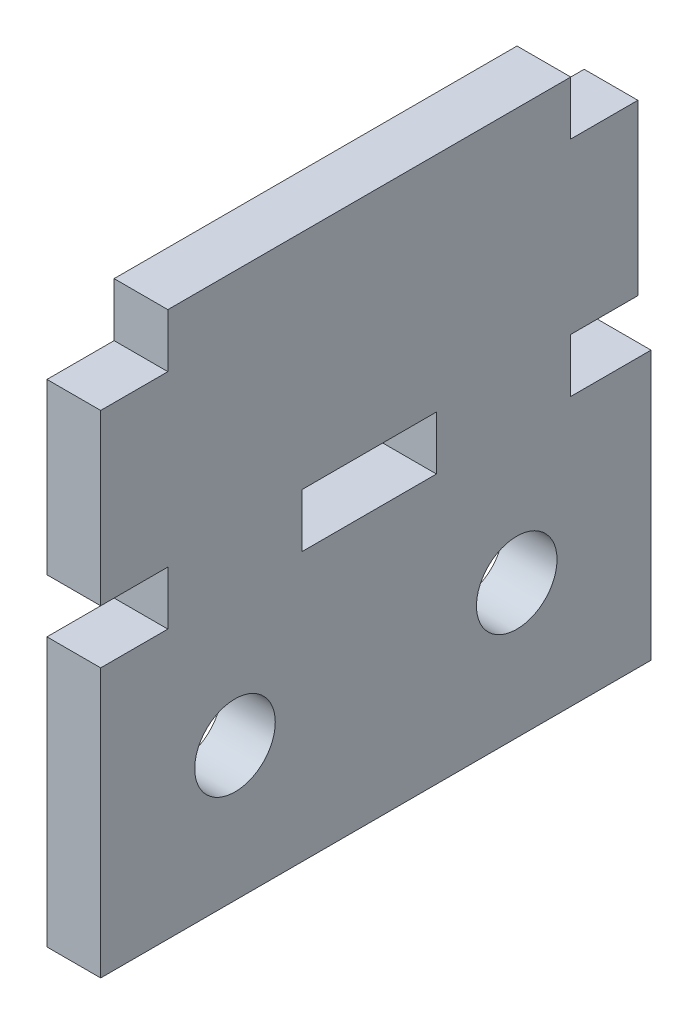
ISO-10303-21;
HEADER;
FILE_DESCRIPTION(('STEP AP214'),'2;1');
FILE_NAME('part.step','',(''),(''),'','','');
FILE_SCHEMA(('AUTOMOTIVE_DESIGN { 1 0 10303 214 1 1 1 1 }'));
ENDSEC;
DATA;
#1=APPLICATION_CONTEXT('core data for automotive mechanical design processes');
#2=APPLICATION_PROTOCOL_DEFINITION('international standard','automotive_design',2000,#1);
#3=PRODUCT_CONTEXT('',#1,'mechanical');
#4=PRODUCT('Part','Part','',(#3));
#5=PRODUCT_RELATED_PRODUCT_CATEGORY('part','',(#4));
#6=PRODUCT_DEFINITION_FORMATION('','',#4);
#7=PRODUCT_DEFINITION_CONTEXT('part definition',#1,'design');
#8=PRODUCT_DEFINITION('design','',#6,#7);
#9=PRODUCT_DEFINITION_SHAPE('','',#8);
#10=(LENGTH_UNIT() NAMED_UNIT(*) SI_UNIT(.MILLI.,.METRE.));
#11=(NAMED_UNIT(*) PLANE_ANGLE_UNIT() SI_UNIT($,.RADIAN.));
#12=(NAMED_UNIT(*) SI_UNIT($,.STERADIAN.) SOLID_ANGLE_UNIT());
#13=UNCERTAINTY_MEASURE_WITH_UNIT(LENGTH_MEASURE(1.E-05),#10,'distance_accuracy_value','');
#14=(GEOMETRIC_REPRESENTATION_CONTEXT(3) GLOBAL_UNCERTAINTY_ASSIGNED_CONTEXT((#13)) GLOBAL_UNIT_ASSIGNED_CONTEXT((#10,
#11,#12)) REPRESENTATION_CONTEXT('',''));
#15=CARTESIAN_POINT('',(0.,0.,0.));
#16=DIRECTION('',(0.,0.,1.));
#17=DIRECTION('',(1.,0.,0.));
#18=AXIS2_PLACEMENT_3D('',#15,#16,#17);
#19=CARTESIAN_POINT('',(2.,-3.15,-7.5));
#20=DIRECTION('',(0.,1.,0.));
#21=DIRECTION('',(0.,0.,1.));
#22=AXIS2_PLACEMENT_3D('',#19,#20,#21);
#23=PLANE('',#22);
#24=DIRECTION('',(0.,0.,-1.));
#25=VECTOR('',#24,1.);
#26=CARTESIAN_POINT('',(0.,-3.15,-7.5));
#27=LINE('',#26,#25);
#28=CARTESIAN_POINT('',(0.,-3.15,-7.5));
#29=VERTEX_POINT('',#28);
#30=CARTESIAN_POINT('',(0.,-3.15,-10.));
#31=VERTEX_POINT('',#30);
#32=EDGE_CURVE('E184',#29,#31,#27,.T.);
#33=ORIENTED_EDGE('',*,*,#32,.T.);
#34=DIRECTION('',(-1.,0.,0.));
#35=VECTOR('',#34,1.);
#36=CARTESIAN_POINT('',(2.,-3.15,-10.));
#37=LINE('',#36,#35);
#38=CARTESIAN_POINT('',(2.,-3.15,-10.));
#39=VERTEX_POINT('',#38);
#40=EDGE_CURVE('E11',#39,#31,#37,.T.);
#41=ORIENTED_EDGE('',*,*,#40,.F.);
#42=DIRECTION('',(0.,0.,-1.));
#43=VECTOR('',#42,1.);
#44=CARTESIAN_POINT('',(2.,-3.15,-7.5));
#45=LINE('',#44,#43);
#46=CARTESIAN_POINT('',(2.,-3.15,-7.5));
#47=VERTEX_POINT('',#46);
#48=EDGE_CURVE('E195',#47,#39,#45,.T.);
#49=ORIENTED_EDGE('',*,*,#48,.F.);
#50=DIRECTION('',(-1.,0.,0.));
#51=VECTOR('',#50,1.);
#52=CARTESIAN_POINT('',(2.,-3.15,-7.5));
#53=LINE('',#52,#51);
#54=EDGE_CURVE('E218',#47,#29,#53,.T.);
#55=ORIENTED_EDGE('',*,*,#54,.T.);
#56=EDGE_LOOP('',(#33,#41,#49,#55));
#57=FACE_BOUND('',#56,.T.);
#58=ADVANCED_FACE('F32',(#57),#23,.F.);
#59=CARTESIAN_POINT('',(2.,3.15,-10.));
#60=DIRECTION('',(0.,0.,1.));
#61=DIRECTION('',(1.,0.,0.));
#62=AXIS2_PLACEMENT_3D('',#59,#60,#61);
#63=PLANE('',#62);
#64=DIRECTION('',(0.,1.,0.));
#65=VECTOR('',#64,1.);
#66=CARTESIAN_POINT('',(0.,3.15,-10.));
#67=LINE('',#66,#65);
#68=CARTESIAN_POINT('',(0.,3.15,-10.));
#69=VERTEX_POINT('',#68);
#70=EDGE_CURVE('E221',#31,#69,#67,.T.);
#71=ORIENTED_EDGE('',*,*,#70,.T.);
#72=DIRECTION('',(-1.,0.,0.));
#73=VECTOR('',#72,1.);
#74=CARTESIAN_POINT('',(2.,3.15,-10.));
#75=LINE('',#74,#73);
#76=CARTESIAN_POINT('',(2.,3.15,-10.));
#77=VERTEX_POINT('',#76);
#78=EDGE_CURVE('E40',#77,#69,#75,.T.);
#79=ORIENTED_EDGE('',*,*,#78,.F.);
#80=DIRECTION('',(0.,1.,0.));
#81=VECTOR('',#80,1.);
#82=CARTESIAN_POINT('',(2.,3.15,-10.));
#83=LINE('',#82,#81);
#84=EDGE_CURVE('E111',#39,#77,#83,.T.);
#85=ORIENTED_EDGE('',*,*,#84,.F.);
#86=ORIENTED_EDGE('',*,*,#40,.T.);
#87=EDGE_LOOP('',(#71,#79,#85,#86));
#88=FACE_BOUND('',#87,.T.);
#89=ADVANCED_FACE('F302',(#88),#63,.F.);
#90=CARTESIAN_POINT('',(2.,3.15,-7.5));
#91=DIRECTION('',(0.,-1.,0.));
#92=DIRECTION('',(0.,0.,-1.));
#93=AXIS2_PLACEMENT_3D('',#90,#91,#92);
#94=PLANE('',#93);
#95=DIRECTION('',(0.,0.,1.));
#96=VECTOR('',#95,1.);
#97=CARTESIAN_POINT('',(0.,3.15,-7.5));
#98=LINE('',#97,#96);
#99=CARTESIAN_POINT('',(0.,3.15,-7.5));
#100=VERTEX_POINT('',#99);
#101=EDGE_CURVE('E223',#69,#100,#98,.T.);
#102=ORIENTED_EDGE('',*,*,#101,.T.);
#103=DIRECTION('',(-1.,0.,0.));
#104=VECTOR('',#103,1.);
#105=CARTESIAN_POINT('',(2.,3.15,-7.5));
#106=LINE('',#105,#104);
#107=CARTESIAN_POINT('',(2.,3.15,-7.5));
#108=VERTEX_POINT('',#107);
#109=EDGE_CURVE('E274',#108,#100,#106,.T.);
#110=ORIENTED_EDGE('',*,*,#109,.F.);
#111=DIRECTION('',(0.,0.,1.));
#112=VECTOR('',#111,1.);
#113=CARTESIAN_POINT('',(2.,3.15,-7.5));
#114=LINE('',#113,#112);
#115=EDGE_CURVE('E198',#77,#108,#114,.T.);
#116=ORIENTED_EDGE('',*,*,#115,.F.);
#117=ORIENTED_EDGE('',*,*,#78,.T.);
#118=EDGE_LOOP('',(#102,#110,#116,#117));
#119=FACE_BOUND('',#118,.T.);
#120=ADVANCED_FACE('F280',(#119),#94,.F.);
#121=CARTESIAN_POINT('',(2.,5.15,-7.5));
#122=DIRECTION('',(0.,0.,1.));
#123=DIRECTION('',(0.,-1.,0.));
#124=AXIS2_PLACEMENT_3D('',#121,#122,#123);
#125=PLANE('',#124);
#126=DIRECTION('',(0.,1.,0.));
#127=VECTOR('',#126,1.);
#128=CARTESIAN_POINT('',(0.,5.15,-7.5));
#129=LINE('',#128,#127);
#130=CARTESIAN_POINT('',(0.,5.15,-7.5));
#131=VERTEX_POINT('',#130);
#132=EDGE_CURVE('E225',#100,#131,#129,.T.);
#133=ORIENTED_EDGE('',*,*,#132,.T.);
#134=DIRECTION('',(-1.,0.,0.));
#135=VECTOR('',#134,1.);
#136=CARTESIAN_POINT('',(2.,5.15,-7.5));
#137=LINE('',#136,#135);
#138=CARTESIAN_POINT('',(2.,5.15,-7.5));
#139=VERTEX_POINT('',#138);
#140=EDGE_CURVE('E271',#139,#131,#137,.T.);
#141=ORIENTED_EDGE('',*,*,#140,.F.);
#142=DIRECTION('',(0.,1.,0.));
#143=VECTOR('',#142,1.);
#144=CARTESIAN_POINT('',(2.,5.15,-7.5));
#145=LINE('',#144,#143);
#146=EDGE_CURVE('E200',#108,#139,#145,.T.);
#147=ORIENTED_EDGE('',*,*,#146,.F.);
#148=ORIENTED_EDGE('',*,*,#109,.T.);
#149=EDGE_LOOP('',(#133,#141,#147,#148));
#150=FACE_BOUND('',#149,.T.);
#151=ADVANCED_FACE('F290',(#150),#125,.F.);
#152=CARTESIAN_POINT('',(2.,5.15,7.5));
#153=DIRECTION('',(0.,-1.,0.));
#154=DIRECTION('',(0.,0.,-1.));
#155=AXIS2_PLACEMENT_3D('',#152,#153,#154);
#156=PLANE('',#155);
#157=DIRECTION('',(0.,0.,1.));
#158=VECTOR('',#157,1.);
#159=CARTESIAN_POINT('',(0.,5.15,7.5));
#160=LINE('',#159,#158);
#161=CARTESIAN_POINT('',(0.,5.15,7.5));
#162=VERTEX_POINT('',#161);
#163=EDGE_CURVE('E228',#131,#162,#160,.T.);
#164=ORIENTED_EDGE('',*,*,#163,.T.);
#165=DIRECTION('',(-1.,0.,0.));
#166=VECTOR('',#165,1.);
#167=CARTESIAN_POINT('',(2.,5.15,7.5));
#168=LINE('',#167,#166);
#169=CARTESIAN_POINT('',(2.,5.15,7.5));
#170=VERTEX_POINT('',#169);
#171=EDGE_CURVE('E268',#170,#162,#168,.T.);
#172=ORIENTED_EDGE('',*,*,#171,.F.);
#173=DIRECTION('',(0.,0.,1.));
#174=VECTOR('',#173,1.);
#175=CARTESIAN_POINT('',(2.,5.15,-2.5));
#176=LINE('',#175,#174);
#177=EDGE_CURVE('E202',#139,#170,#176,.T.);
#178=ORIENTED_EDGE('',*,*,#177,.F.);
#179=ORIENTED_EDGE('',*,*,#140,.T.);
#180=EDGE_LOOP('',(#164,#172,#178,#179));
#181=FACE_BOUND('',#180,.T.);
#182=ADVANCED_FACE('F294',(#181),#156,.F.);
#183=CARTESIAN_POINT('',(2.,3.15,7.5));
#184=DIRECTION('',(0.,0.,-1.));
#185=DIRECTION('',(-1.,0.,0.));
#186=AXIS2_PLACEMENT_3D('',#183,#184,#185);
#187=PLANE('',#186);
#188=DIRECTION('',(0.,-1.,0.));
#189=VECTOR('',#188,1.);
#190=CARTESIAN_POINT('',(0.,3.15,7.5));
#191=LINE('',#190,#189);
#192=CARTESIAN_POINT('',(0.,3.15,7.5));
#193=VERTEX_POINT('',#192);
#194=EDGE_CURVE('E230',#162,#193,#191,.T.);
#195=ORIENTED_EDGE('',*,*,#194,.T.);
#196=DIRECTION('',(-1.,0.,0.));
#197=VECTOR('',#196,1.);
#198=CARTESIAN_POINT('',(2.,3.15,7.5));
#199=LINE('',#198,#197);
#200=CARTESIAN_POINT('',(2.,3.15,7.5));
#201=VERTEX_POINT('',#200);
#202=EDGE_CURVE('E265',#201,#193,#199,.T.);
#203=ORIENTED_EDGE('',*,*,#202,.F.);
#204=DIRECTION('',(0.,-1.,0.));
#205=VECTOR('',#204,1.);
#206=CARTESIAN_POINT('',(2.,3.15,7.5));
#207=LINE('',#206,#205);
#208=EDGE_CURVE('E204',#170,#201,#207,.T.);
#209=ORIENTED_EDGE('',*,*,#208,.F.);
#210=ORIENTED_EDGE('',*,*,#171,.T.);
#211=EDGE_LOOP('',(#195,#203,#209,#210));
#212=FACE_BOUND('',#211,.T.);
#213=ADVANCED_FACE('F314',(#212),#187,.F.);
#214=CARTESIAN_POINT('',(2.,3.15,10.));
#215=DIRECTION('',(0.,-1.,0.));
#216=DIRECTION('',(0.,0.,-1.));
#217=AXIS2_PLACEMENT_3D('',#214,#215,#216);
#218=PLANE('',#217);
#219=DIRECTION('',(0.,0.,1.));
#220=VECTOR('',#219,1.);
#221=CARTESIAN_POINT('',(0.,3.15,10.));
#222=LINE('',#221,#220);
#223=CARTESIAN_POINT('',(0.,3.15,10.));
#224=VERTEX_POINT('',#223);
#225=EDGE_CURVE('E232',#193,#224,#222,.T.);
#226=ORIENTED_EDGE('',*,*,#225,.T.);
#227=DIRECTION('',(-1.,0.,0.));
#228=VECTOR('',#227,1.);
#229=CARTESIAN_POINT('',(2.,3.15,10.));
#230=LINE('',#229,#228);
#231=CARTESIAN_POINT('',(2.,3.15,10.));
#232=VERTEX_POINT('',#231);
#233=EDGE_CURVE('E262',#232,#224,#230,.T.);
#234=ORIENTED_EDGE('',*,*,#233,.F.);
#235=DIRECTION('',(0.,0.,1.));
#236=VECTOR('',#235,1.);
#237=CARTESIAN_POINT('',(2.,3.15,10.));
#238=LINE('',#237,#236);
#239=EDGE_CURVE('E206',#201,#232,#238,.T.);
#240=ORIENTED_EDGE('',*,*,#239,.F.);
#241=ORIENTED_EDGE('',*,*,#202,.T.);
#242=EDGE_LOOP('',(#226,#234,#240,#241));
#243=FACE_BOUND('',#242,.T.);
#244=ADVANCED_FACE('F317',(#243),#218,.F.);
#245=CARTESIAN_POINT('',(2.,3.15,10.));
#246=DIRECTION('',(0.,0.,-1.));
#247=DIRECTION('',(-1.,0.,0.));
#248=AXIS2_PLACEMENT_3D('',#245,#246,#247);
#249=PLANE('',#248);
#250=DIRECTION('',(0.,-1.,0.));
#251=VECTOR('',#250,1.);
#252=CARTESIAN_POINT('',(0.,3.15,10.));
#253=LINE('',#252,#251);
#254=CARTESIAN_POINT('',(0.,-3.15,10.));
#255=VERTEX_POINT('',#254);
#256=EDGE_CURVE('E234',#224,#255,#253,.T.);
#257=ORIENTED_EDGE('',*,*,#256,.T.);
#258=DIRECTION('',(-1.,0.,0.));
#259=VECTOR('',#258,1.);
#260=CARTESIAN_POINT('',(2.,-3.15,10.));
#261=LINE('',#260,#259);
#262=CARTESIAN_POINT('',(2.,-3.15,10.));
#263=VERTEX_POINT('',#262);
#264=EDGE_CURVE('E259',#263,#255,#261,.T.);
#265=ORIENTED_EDGE('',*,*,#264,.F.);
#266=DIRECTION('',(0.,-1.,0.));
#267=VECTOR('',#266,1.);
#268=CARTESIAN_POINT('',(2.,3.15,10.));
#269=LINE('',#268,#267);
#270=EDGE_CURVE('E208',#232,#263,#269,.T.);
#271=ORIENTED_EDGE('',*,*,#270,.F.);
#272=ORIENTED_EDGE('',*,*,#233,.T.);
#273=EDGE_LOOP('',(#257,#265,#271,#272));
#274=FACE_BOUND('',#273,.T.);
#275=ADVANCED_FACE('F321',(#274),#249,.F.);
#276=CARTESIAN_POINT('',(2.,-3.15,10.));
#277=DIRECTION('',(0.,1.,0.));
#278=DIRECTION('',(0.,0.,1.));
#279=AXIS2_PLACEMENT_3D('',#276,#277,#278);
#280=PLANE('',#279);
#281=DIRECTION('',(0.,0.,-1.));
#282=VECTOR('',#281,1.);
#283=CARTESIAN_POINT('',(0.,-3.15,10.));
#284=LINE('',#283,#282);
#285=CARTESIAN_POINT('',(0.,-3.15,7.5));
#286=VERTEX_POINT('',#285);
#287=EDGE_CURVE('E236',#255,#286,#284,.T.);
#288=ORIENTED_EDGE('',*,*,#287,.T.);
#289=DIRECTION('',(-1.,0.,0.));
#290=VECTOR('',#289,1.);
#291=CARTESIAN_POINT('',(2.,-3.15,7.5));
#292=LINE('',#291,#290);
#293=CARTESIAN_POINT('',(2.,-3.15,7.5));
#294=VERTEX_POINT('',#293);
#295=EDGE_CURVE('E256',#294,#286,#292,.T.);
#296=ORIENTED_EDGE('',*,*,#295,.F.);
#297=DIRECTION('',(0.,0.,-1.));
#298=VECTOR('',#297,1.);
#299=CARTESIAN_POINT('',(2.,-3.15,10.));
#300=LINE('',#299,#298);
#301=EDGE_CURVE('E210',#263,#294,#300,.T.);
#302=ORIENTED_EDGE('',*,*,#301,.F.);
#303=ORIENTED_EDGE('',*,*,#264,.T.);
#304=EDGE_LOOP('',(#288,#296,#302,#303));
#305=FACE_BOUND('',#304,.T.);
#306=ADVANCED_FACE('F325',(#305),#280,.F.);
#307=CARTESIAN_POINT('',(2.,-3.15,7.5));
#308=DIRECTION('',(0.,0.,-1.));
#309=DIRECTION('',(-1.,0.,0.));
#310=AXIS2_PLACEMENT_3D('',#307,#308,#309);
#311=PLANE('',#310);
#312=DIRECTION('',(0.,-1.,0.));
#313=VECTOR('',#312,1.);
#314=CARTESIAN_POINT('',(0.,-3.15,7.5));
#315=LINE('',#314,#313);
#316=CARTESIAN_POINT('',(0.,-5.15,7.5));
#317=VERTEX_POINT('',#316);
#318=EDGE_CURVE('E238',#286,#317,#315,.T.);
#319=ORIENTED_EDGE('',*,*,#318,.T.);
#320=DIRECTION('',(-1.,0.,0.));
#321=VECTOR('',#320,1.);
#322=CARTESIAN_POINT('',(2.,-5.15,7.5));
#323=LINE('',#322,#321);
#324=CARTESIAN_POINT('',(2.,-5.15,7.5));
#325=VERTEX_POINT('',#324);
#326=EDGE_CURVE('E253',#325,#317,#323,.T.);
#327=ORIENTED_EDGE('',*,*,#326,.F.);
#328=DIRECTION('',(0.,-1.,0.));
#329=VECTOR('',#328,1.);
#330=CARTESIAN_POINT('',(2.,-3.15,7.5));
#331=LINE('',#330,#329);
#332=EDGE_CURVE('E212',#294,#325,#331,.T.);
#333=ORIENTED_EDGE('',*,*,#332,.F.);
#334=ORIENTED_EDGE('',*,*,#295,.T.);
#335=EDGE_LOOP('',(#319,#327,#333,#334));
#336=FACE_BOUND('',#335,.T.);
#337=ADVANCED_FACE('F329',(#336),#311,.F.);
#338=CARTESIAN_POINT('',(2.,-5.15,2.5));
#339=DIRECTION('',(0.,0.,1.));
#340=DIRECTION('',(1.,0.,0.));
#341=AXIS2_PLACEMENT_3D('',#338,#339,#340);
#342=PLANE('',#341);
#343=DIRECTION('',(0.,1.,0.));
#344=VECTOR('',#343,1.);
#345=CARTESIAN_POINT('',(0.,-5.15,2.5));
#346=LINE('',#345,#344);
#347=CARTESIAN_POINT('',(0.,-5.15,2.5));
#348=VERTEX_POINT('',#347);
#349=CARTESIAN_POINT('',(0.,-3.15,2.5));
#350=VERTEX_POINT('',#349);
#351=EDGE_CURVE('E240',#348,#350,#346,.T.);
#352=ORIENTED_EDGE('',*,*,#351,.T.);
#353=DIRECTION('',(-1.,0.,0.));
#354=VECTOR('',#353,1.);
#355=CARTESIAN_POINT('',(2.,-3.15,2.5));
#356=LINE('',#355,#354);
#357=CARTESIAN_POINT('',(2.,-3.15,2.5));
#358=VERTEX_POINT('',#357);
#359=EDGE_CURVE('E249',#358,#350,#356,.T.);
#360=ORIENTED_EDGE('',*,*,#359,.F.);
#361=DIRECTION('',(0.,1.,0.));
#362=VECTOR('',#361,1.);
#363=CARTESIAN_POINT('',(2.,-5.15,2.5));
#364=LINE('',#363,#362);
#365=CARTESIAN_POINT('',(2.,-5.15,2.5));
#366=VERTEX_POINT('',#365);
#367=EDGE_CURVE('E214',#366,#358,#364,.T.);
#368=ORIENTED_EDGE('',*,*,#367,.F.);
#369=DIRECTION('',(-1.,0.,0.));
#370=VECTOR('',#369,1.);
#371=CARTESIAN_POINT('',(2.,-5.15,2.5));
#372=LINE('',#371,#370);
#373=EDGE_CURVE('E171',#366,#348,#372,.T.);
#374=ORIENTED_EDGE('',*,*,#373,.T.);
#375=EDGE_LOOP('',(#352,#360,#368,#374));
#376=FACE_BOUND('',#375,.T.);
#377=ADVANCED_FACE('F333',(#376),#342,.F.);
#378=CARTESIAN_POINT('',(2.,-3.15,2.5));
#379=DIRECTION('',(0.,1.,0.));
#380=DIRECTION('',(0.,0.,1.));
#381=AXIS2_PLACEMENT_3D('',#378,#379,#380);
#382=PLANE('',#381);
#383=DIRECTION('',(0.,0.,-1.));
#384=VECTOR('',#383,1.);
#385=CARTESIAN_POINT('',(0.,-3.15,2.5));
#386=LINE('',#385,#384);
#387=CARTESIAN_POINT('',(0.,-3.15,-2.5));
#388=VERTEX_POINT('',#387);
#389=EDGE_CURVE('E242',#350,#388,#386,.T.);
#390=ORIENTED_EDGE('',*,*,#389,.T.);
#391=DIRECTION('',(-1.,0.,0.));
#392=VECTOR('',#391,1.);
#393=CARTESIAN_POINT('',(2.,-3.15,-2.5));
#394=LINE('',#393,#392);
#395=CARTESIAN_POINT('',(2.,-3.15,-2.5));
#396=VERTEX_POINT('',#395);
#397=EDGE_CURVE('E165',#396,#388,#394,.T.);
#398=ORIENTED_EDGE('',*,*,#397,.F.);
#399=DIRECTION('',(0.,0.,-1.));
#400=VECTOR('',#399,1.);
#401=CARTESIAN_POINT('',(2.,-3.15,2.5));
#402=LINE('',#401,#400);
#403=EDGE_CURVE('E157',#358,#396,#402,.T.);
#404=ORIENTED_EDGE('',*,*,#403,.F.);
#405=ORIENTED_EDGE('',*,*,#359,.T.);
#406=EDGE_LOOP('',(#390,#398,#404,#405));
#407=FACE_BOUND('',#406,.T.);
#408=ADVANCED_FACE('F337',(#407),#382,.F.);
#409=CARTESIAN_POINT('',(2.,-5.15,-2.5));
#410=DIRECTION('',(0.,0.,-1.));
#411=DIRECTION('',(0.,1.,0.));
#412=AXIS2_PLACEMENT_3D('',#409,#410,#411);
#413=PLANE('',#412);
#414=DIRECTION('',(0.,-1.,0.));
#415=VECTOR('',#414,1.);
#416=CARTESIAN_POINT('',(0.,-5.15,-2.5));
#417=LINE('',#416,#415);
#418=CARTESIAN_POINT('',(0.,-5.15,-2.5));
#419=VERTEX_POINT('',#418);
#420=EDGE_CURVE('E96',#388,#419,#417,.T.);
#421=ORIENTED_EDGE('',*,*,#420,.T.);
#422=DIRECTION('',(-1.,0.,0.));
#423=VECTOR('',#422,1.);
#424=CARTESIAN_POINT('',(2.,-5.15,-2.5));
#425=LINE('',#424,#423);
#426=CARTESIAN_POINT('',(2.,-5.15,-2.5));
#427=VERTEX_POINT('',#426);
#428=EDGE_CURVE('E160',#427,#419,#425,.T.);
#429=ORIENTED_EDGE('',*,*,#428,.F.);
#430=DIRECTION('',(0.,-1.,0.));
#431=VECTOR('',#430,1.);
#432=CARTESIAN_POINT('',(2.,-5.15,-2.5));
#433=LINE('',#432,#431);
#434=EDGE_CURVE('E152',#396,#427,#433,.T.);
#435=ORIENTED_EDGE('',*,*,#434,.F.);
#436=ORIENTED_EDGE('',*,*,#397,.T.);
#437=EDGE_LOOP('',(#421,#429,#435,#436));
#438=FACE_BOUND('',#437,.T.);
#439=ADVANCED_FACE('F161',(#438),#413,.F.);
#440=CARTESIAN_POINT('',(2.,-3.15,-7.5));
#441=DIRECTION('',(0.,0.,1.));
#442=DIRECTION('',(0.,-1.,0.));
#443=AXIS2_PLACEMENT_3D('',#440,#441,#442);
#444=PLANE('',#443);
#445=DIRECTION('',(0.,1.,0.));
#446=VECTOR('',#445,1.);
#447=CARTESIAN_POINT('',(0.,-3.15,-7.5));
#448=LINE('',#447,#446);
#449=CARTESIAN_POINT('',(0.,-5.15,-7.5));
#450=VERTEX_POINT('',#449);
#451=EDGE_CURVE('E103',#450,#29,#448,.T.);
#452=ORIENTED_EDGE('',*,*,#451,.T.);
#453=ORIENTED_EDGE('',*,*,#54,.F.);
#454=DIRECTION('',(0.,1.,0.));
#455=VECTOR('',#454,1.);
#456=CARTESIAN_POINT('',(2.,-3.15,-7.5));
#457=LINE('',#456,#455);
#458=CARTESIAN_POINT('',(2.,-5.15,-7.5));
#459=VERTEX_POINT('',#458);
#460=EDGE_CURVE('E48',#459,#47,#457,.T.);
#461=ORIENTED_EDGE('',*,*,#460,.F.);
#462=DIRECTION('',(-1.,0.,0.));
#463=VECTOR('',#462,1.);
#464=CARTESIAN_POINT('',(2.,-5.15,-7.5));
#465=LINE('',#464,#463);
#466=EDGE_CURVE('E166',#459,#450,#465,.T.);
#467=ORIENTED_EDGE('',*,*,#466,.T.);
#468=EDGE_LOOP('',(#452,#453,#461,#467));
#469=FACE_BOUND('',#468,.T.);
#470=ADVANCED_FACE('F344',(#469),#444,.F.);
#471=CARTESIAN_POINT('',(2.,0.,0.));
#472=DIRECTION('',(-1.,0.,0.));
#473=DIRECTION('',(0.,0.,1.));
#474=AXIS2_PLACEMENT_3D('',#471,#472,#473);
#475=PLANE('',#474);
#476=DIRECTION('',(0.,0.,1.));
#477=VECTOR('',#476,1.);
#478=CARTESIAN_POINT('',(2.,-5.15,7.5));
#479=LINE('',#478,#477);
#480=EDGE_CURVE('E155',#427,#366,#479,.T.);
#481=ORIENTED_EDGE('',*,*,#480,.T.);
#482=ORIENTED_EDGE('',*,*,#367,.T.);
#483=ORIENTED_EDGE('',*,*,#403,.T.);
#484=ORIENTED_EDGE('',*,*,#434,.T.);
#485=EDGE_LOOP('',(#481,#482,#483,#484));
#486=FACE_BOUND('',#485,.T.);
#487=ORIENTED_EDGE('',*,*,#48,.T.);
#488=ORIENTED_EDGE('',*,*,#84,.T.);
#489=ORIENTED_EDGE('',*,*,#115,.T.);
#490=ORIENTED_EDGE('',*,*,#146,.T.);
#491=ORIENTED_EDGE('',*,*,#177,.T.);
#492=ORIENTED_EDGE('',*,*,#208,.T.);
#493=ORIENTED_EDGE('',*,*,#239,.T.);
#494=ORIENTED_EDGE('',*,*,#270,.T.);
#495=ORIENTED_EDGE('',*,*,#301,.T.);
#496=ORIENTED_EDGE('',*,*,#332,.T.);
#497=CARTESIAN_POINT('',(2.,-5.15,10.));
#498=VERTEX_POINT('',#497);
#499=EDGE_CURVE('E173',#325,#498,#479,.T.);
#500=ORIENTED_EDGE('',*,*,#499,.T.);
#501=DIRECTION('',(0.,-1.,0.));
#502=VECTOR('',#501,1.);
#503=CARTESIAN_POINT('',(2.,-5.15,10.));
#504=LINE('',#503,#502);
#505=CARTESIAN_POINT('',(2.,-15.15,10.));
#506=VERTEX_POINT('',#505);
#507=EDGE_CURVE('E392',#498,#506,#504,.T.);
#508=ORIENTED_EDGE('',*,*,#507,.T.);
#509=DIRECTION('',(0.,0.,-1.));
#510=VECTOR('',#509,1.);
#511=CARTESIAN_POINT('',(2.,-15.15,10.));
#512=LINE('',#511,#510);
#513=CARTESIAN_POINT('',(2.,-15.15,-10.4893749474207));
#514=VERTEX_POINT('',#513);
#515=EDGE_CURVE('E408',#506,#514,#512,.T.);
#516=ORIENTED_EDGE('',*,*,#515,.T.);
#517=DIRECTION('',(0.,1.,0.));
#518=VECTOR('',#517,1.);
#519=CARTESIAN_POINT('',(2.,-15.15,-10.4893749474207));
#520=LINE('',#519,#518);
#521=CARTESIAN_POINT('',(2.,-5.15,-10.4893749474207));
#522=VERTEX_POINT('',#521);
#523=EDGE_CURVE('E177',#514,#522,#520,.T.);
#524=ORIENTED_EDGE('',*,*,#523,.T.);
#525=EDGE_CURVE('E172',#522,#459,#479,.T.);
#526=ORIENTED_EDGE('',*,*,#525,.T.);
#527=ORIENTED_EDGE('',*,*,#460,.T.);
#528=EDGE_LOOP('',(#487,#488,#489,#490,#491,#492,#493,#494,#495,#496,#500,#508,#516,#524,#526,#527));
#529=FACE_BOUND('',#528,.T.);
#530=CARTESIAN_POINT('',(2.,-10.15,-5.48937494742067));
#531=DIRECTION('',(1.,0.,0.));
#532=DIRECTION('',(0.,0.,-1.));
#533=AXIS2_PLACEMENT_3D('',#530,#531,#532);
#534=CIRCLE('',#533,1.5);
#535=CARTESIAN_POINT('',(2.,-10.15,-6.98937494742067));
#536=VERTEX_POINT('',#535);
#537=EDGE_CURVE('E384',#536,#536,#534,.T.);
#538=ORIENTED_EDGE('',*,*,#537,.F.);
#539=EDGE_LOOP('',(#538));
#540=FACE_BOUND('',#539,.T.);
#541=CARTESIAN_POINT('',(2.,-10.15,5.));
#542=DIRECTION('',(1.,0.,0.));
#543=DIRECTION('',(0.,0.,-1.));
#544=AXIS2_PLACEMENT_3D('',#541,#542,#543);
#545=CIRCLE('',#544,1.5);
#546=CARTESIAN_POINT('',(2.,-10.15,3.5));
#547=VERTEX_POINT('',#546);
#548=EDGE_CURVE('E386',#547,#547,#545,.T.);
#549=ORIENTED_EDGE('',*,*,#548,.F.);
#550=EDGE_LOOP('',(#549));
#551=FACE_BOUND('',#550,.T.);
#552=ADVANCED_FACE('F153',(#486,#529,#540,#551),#475,.F.);
#553=CARTESIAN_POINT('',(0.,0.,0.));
#554=DIRECTION('',(-1.,0.,0.));
#555=DIRECTION('',(0.,0.,1.));
#556=AXIS2_PLACEMENT_3D('',#553,#554,#555);
#557=PLANE('',#556);
#558=ORIENTED_EDGE('',*,*,#351,.F.);
#559=DIRECTION('',(0.,0.,1.));
#560=VECTOR('',#559,1.);
#561=CARTESIAN_POINT('',(0.,-5.15,7.5));
#562=LINE('',#561,#560);
#563=EDGE_CURVE('E399',#419,#348,#562,.T.);
#564=ORIENTED_EDGE('',*,*,#563,.F.);
#565=ORIENTED_EDGE('',*,*,#420,.F.);
#566=ORIENTED_EDGE('',*,*,#389,.F.);
#567=EDGE_LOOP('',(#558,#564,#565,#566));
#568=FACE_BOUND('',#567,.T.);
#569=ORIENTED_EDGE('',*,*,#32,.F.);
#570=ORIENTED_EDGE('',*,*,#451,.F.);
#571=CARTESIAN_POINT('',(0.,-5.15,-10.4893749474207));
#572=VERTEX_POINT('',#571);
#573=EDGE_CURVE('E395',#572,#450,#562,.T.);
#574=ORIENTED_EDGE('',*,*,#573,.F.);
#575=DIRECTION('',(0.,1.,0.));
#576=VECTOR('',#575,1.);
#577=CARTESIAN_POINT('',(0.,-15.15,-10.4893749474207));
#578=LINE('',#577,#576);
#579=CARTESIAN_POINT('',(0.,-15.15,-10.4893749474207));
#580=VERTEX_POINT('',#579);
#581=EDGE_CURVE('E194',#580,#572,#578,.T.);
#582=ORIENTED_EDGE('',*,*,#581,.F.);
#583=DIRECTION('',(0.,0.,-1.));
#584=VECTOR('',#583,1.);
#585=CARTESIAN_POINT('',(0.,-15.15,10.));
#586=LINE('',#585,#584);
#587=CARTESIAN_POINT('',(0.,-15.15,10.));
#588=VERTEX_POINT('',#587);
#589=EDGE_CURVE('E402',#588,#580,#586,.T.);
#590=ORIENTED_EDGE('',*,*,#589,.F.);
#591=DIRECTION('',(0.,-1.,0.));
#592=VECTOR('',#591,1.);
#593=CARTESIAN_POINT('',(0.,-5.15,10.));
#594=LINE('',#593,#592);
#595=CARTESIAN_POINT('',(0.,-5.15,10.));
#596=VERTEX_POINT('',#595);
#597=EDGE_CURVE('E398',#596,#588,#594,.T.);
#598=ORIENTED_EDGE('',*,*,#597,.F.);
#599=EDGE_CURVE('E175',#317,#596,#562,.T.);
#600=ORIENTED_EDGE('',*,*,#599,.F.);
#601=ORIENTED_EDGE('',*,*,#318,.F.);
#602=ORIENTED_EDGE('',*,*,#287,.F.);
#603=ORIENTED_EDGE('',*,*,#256,.F.);
#604=ORIENTED_EDGE('',*,*,#225,.F.);
#605=ORIENTED_EDGE('',*,*,#194,.F.);
#606=ORIENTED_EDGE('',*,*,#163,.F.);
#607=ORIENTED_EDGE('',*,*,#132,.F.);
#608=ORIENTED_EDGE('',*,*,#101,.F.);
#609=ORIENTED_EDGE('',*,*,#70,.F.);
#610=EDGE_LOOP('',(#569,#570,#574,#582,#590,#598,#600,#601,#602,#603,#604,#605,#606,#607,#608,#609));
#611=FACE_BOUND('',#610,.T.);
#612=CARTESIAN_POINT('',(0.,-10.15,-5.48937494742067));
#613=DIRECTION('',(1.,0.,0.));
#614=DIRECTION('',(0.,0.,-1.));
#615=AXIS2_PLACEMENT_3D('',#612,#613,#614);
#616=CIRCLE('',#615,1.5);
#617=CARTESIAN_POINT('',(0.,-10.15,-6.98937494742067));
#618=VERTEX_POINT('',#617);
#619=EDGE_CURVE('E381',#618,#618,#616,.T.);
#620=ORIENTED_EDGE('',*,*,#619,.T.);
#621=EDGE_LOOP('',(#620));
#622=FACE_BOUND('',#621,.T.);
#623=CARTESIAN_POINT('',(0.,-10.15,5.));
#624=DIRECTION('',(1.,0.,0.));
#625=DIRECTION('',(0.,0.,-1.));
#626=AXIS2_PLACEMENT_3D('',#623,#624,#625);
#627=CIRCLE('',#626,1.5);
#628=CARTESIAN_POINT('',(0.,-10.15,3.5));
#629=VERTEX_POINT('',#628);
#630=EDGE_CURVE('E389',#629,#629,#627,.T.);
#631=ORIENTED_EDGE('',*,*,#630,.T.);
#632=EDGE_LOOP('',(#631));
#633=FACE_BOUND('',#632,.T.);
#634=ADVANCED_FACE('F285',(#568,#611,#622,#633),#557,.T.);
#635=CARTESIAN_POINT('',(0.,-5.15,7.5));
#636=DIRECTION('',(0.,1.,0.));
#637=DIRECTION('',(0.,0.,1.));
#638=AXIS2_PLACEMENT_3D('',#635,#636,#637);
#639=PLANE('',#638);
#640=ORIENTED_EDGE('',*,*,#326,.T.);
#641=ORIENTED_EDGE('',*,*,#599,.T.);
#642=DIRECTION('',(1.,0.,0.));
#643=VECTOR('',#642,1.);
#644=CARTESIAN_POINT('',(0.,-5.15,10.));
#645=LINE('',#644,#643);
#646=EDGE_CURVE('E191',#596,#498,#645,.T.);
#647=ORIENTED_EDGE('',*,*,#646,.T.);
#648=ORIENTED_EDGE('',*,*,#499,.F.);
#649=EDGE_LOOP('',(#640,#641,#647,#648));
#650=FACE_BOUND('',#649,.T.);
#651=ADVANCED_FACE('F349',(#650),#639,.T.);
#652=ORIENTED_EDGE('',*,*,#373,.F.);
#653=ORIENTED_EDGE('',*,*,#480,.F.);
#654=ORIENTED_EDGE('',*,*,#428,.T.);
#655=ORIENTED_EDGE('',*,*,#563,.T.);
#656=EDGE_LOOP('',(#652,#653,#654,#655));
#657=FACE_BOUND('',#656,.T.);
#658=ADVANCED_FACE('F169',(#657),#639,.T.);
#659=ORIENTED_EDGE('',*,*,#466,.F.);
#660=ORIENTED_EDGE('',*,*,#525,.F.);
#661=DIRECTION('',(1.,0.,0.));
#662=VECTOR('',#661,1.);
#663=CARTESIAN_POINT('',(0.,-5.15,-10.4893749474207));
#664=LINE('',#663,#662);
#665=EDGE_CURVE('E181',#572,#522,#664,.T.);
#666=ORIENTED_EDGE('',*,*,#665,.F.);
#667=ORIENTED_EDGE('',*,*,#573,.T.);
#668=EDGE_LOOP('',(#659,#660,#666,#667));
#669=FACE_BOUND('',#668,.T.);
#670=ADVANCED_FACE('F365',(#669),#639,.T.);
#671=CARTESIAN_POINT('',(0.,-15.15,-10.4893749474207));
#672=DIRECTION('',(0.,0.,-1.));
#673=DIRECTION('',(0.,1.,0.));
#674=AXIS2_PLACEMENT_3D('',#671,#672,#673);
#675=PLANE('',#674);
#676=ORIENTED_EDGE('',*,*,#523,.F.);
#677=DIRECTION('',(1.,0.,0.));
#678=VECTOR('',#677,1.);
#679=CARTESIAN_POINT('',(0.,-15.15,-10.4893749474207));
#680=LINE('',#679,#678);
#681=EDGE_CURVE('E185',#580,#514,#680,.T.);
#682=ORIENTED_EDGE('',*,*,#681,.F.);
#683=ORIENTED_EDGE('',*,*,#581,.T.);
#684=ORIENTED_EDGE('',*,*,#665,.T.);
#685=EDGE_LOOP('',(#676,#682,#683,#684));
#686=FACE_BOUND('',#685,.T.);
#687=ADVANCED_FACE('F361',(#686),#675,.T.);
#688=CARTESIAN_POINT('',(0.,-15.15,10.));
#689=DIRECTION('',(0.,-1.,0.));
#690=DIRECTION('',(0.,0.,-1.));
#691=AXIS2_PLACEMENT_3D('',#688,#689,#690);
#692=PLANE('',#691);
#693=ORIENTED_EDGE('',*,*,#515,.F.);
#694=DIRECTION('',(1.,0.,0.));
#695=VECTOR('',#694,1.);
#696=CARTESIAN_POINT('',(0.,-15.15,10.));
#697=LINE('',#696,#695);
#698=EDGE_CURVE('E188',#588,#506,#697,.T.);
#699=ORIENTED_EDGE('',*,*,#698,.F.);
#700=ORIENTED_EDGE('',*,*,#589,.T.);
#701=ORIENTED_EDGE('',*,*,#681,.T.);
#702=EDGE_LOOP('',(#693,#699,#700,#701));
#703=FACE_BOUND('',#702,.T.);
#704=ADVANCED_FACE('F357',(#703),#692,.T.);
#705=CARTESIAN_POINT('',(0.,-5.15,10.));
#706=DIRECTION('',(0.,0.,1.));
#707=DIRECTION('',(0.,-1.,0.));
#708=AXIS2_PLACEMENT_3D('',#705,#706,#707);
#709=PLANE('',#708);
#710=ORIENTED_EDGE('',*,*,#507,.F.);
#711=ORIENTED_EDGE('',*,*,#646,.F.);
#712=ORIENTED_EDGE('',*,*,#597,.T.);
#713=ORIENTED_EDGE('',*,*,#698,.T.);
#714=EDGE_LOOP('',(#710,#711,#712,#713));
#715=FACE_BOUND('',#714,.T.);
#716=ADVANCED_FACE('F353',(#715),#709,.T.);
#717=CARTESIAN_POINT('',(0.,-10.15,5.));
#718=DIRECTION('',(1.,0.,0.));
#719=DIRECTION('',(0.,0.,-1.));
#720=AXIS2_PLACEMENT_3D('',#717,#718,#719);
#721=CYLINDRICAL_SURFACE('',#720,1.5);
#722=ORIENTED_EDGE('',*,*,#630,.F.);
#723=EDGE_LOOP('',(#722));
#724=FACE_BOUND('',#723,.T.);
#725=ORIENTED_EDGE('',*,*,#548,.T.);
#726=EDGE_LOOP('',(#725));
#727=FACE_BOUND('',#726,.T.);
#728=ADVANCED_FACE('F356',(#724,#727),#721,.F.);
#729=CARTESIAN_POINT('',(0.,-10.15,-5.48937494742067));
#730=DIRECTION('',(1.,0.,0.));
#731=DIRECTION('',(0.,0.,-1.));
#732=AXIS2_PLACEMENT_3D('',#729,#730,#731);
#733=CYLINDRICAL_SURFACE('',#732,1.5);
#734=ORIENTED_EDGE('',*,*,#619,.F.);
#735=EDGE_LOOP('',(#734));
#736=FACE_BOUND('',#735,.T.);
#737=ORIENTED_EDGE('',*,*,#537,.T.);
#738=EDGE_LOOP('',(#737));
#739=FACE_BOUND('',#738,.T.);
#740=ADVANCED_FACE('F372',(#736,#739),#733,.F.);
#741=CLOSED_SHELL('',(#58,#89,#120,#151,#182,#213,#244,#275,#306,#337,#377,#408,#439,#470,#552,
#634,#651,#658,#670,#687,#704,#716,#728,#740));
#742=MANIFOLD_SOLID_BREP('B2',#741);
#743=ADVANCED_BREP_SHAPE_REPRESENTATION('',(#18,#742),#14);
#744=SHAPE_DEFINITION_REPRESENTATION(#9,#743);
ENDSEC;
END-ISO-10303-21;
